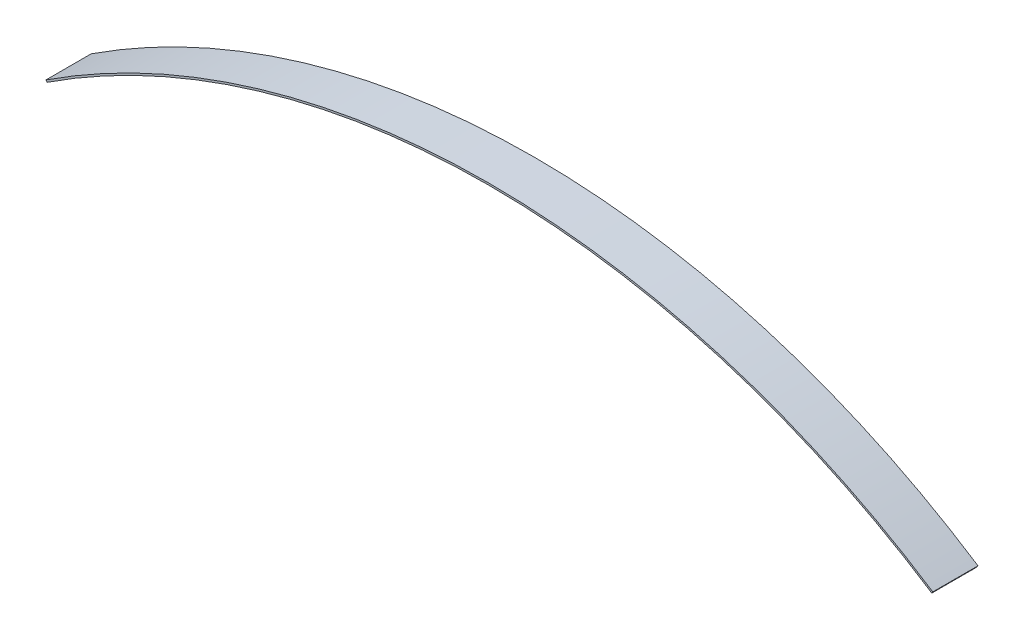
ISO-10303-21;
HEADER;
FILE_DESCRIPTION(('STEP AP214'),'2;1');
FILE_NAME('part.step','',(''),(''),'','','');
FILE_SCHEMA(('AUTOMOTIVE_DESIGN { 1 0 10303 214 1 1 1 1 }'));
ENDSEC;
DATA;
#1=APPLICATION_CONTEXT('core data for automotive mechanical design processes');
#2=APPLICATION_PROTOCOL_DEFINITION('international standard','automotive_design',2000,#1);
#3=PRODUCT_CONTEXT('',#1,'mechanical');
#4=PRODUCT('Part','Part','',(#3));
#5=PRODUCT_RELATED_PRODUCT_CATEGORY('part','',(#4));
#6=PRODUCT_DEFINITION_FORMATION('','',#4);
#7=PRODUCT_DEFINITION_CONTEXT('part definition',#1,'design');
#8=PRODUCT_DEFINITION('design','',#6,#7);
#9=PRODUCT_DEFINITION_SHAPE('','',#8);
#10=(LENGTH_UNIT() NAMED_UNIT(*) SI_UNIT(.MILLI.,.METRE.));
#11=(NAMED_UNIT(*) PLANE_ANGLE_UNIT() SI_UNIT($,.RADIAN.));
#12=(NAMED_UNIT(*) SI_UNIT($,.STERADIAN.) SOLID_ANGLE_UNIT());
#13=UNCERTAINTY_MEASURE_WITH_UNIT(LENGTH_MEASURE(1.E-05),#10,'distance_accuracy_value','');
#14=(GEOMETRIC_REPRESENTATION_CONTEXT(3) GLOBAL_UNCERTAINTY_ASSIGNED_CONTEXT((#13)) GLOBAL_UNIT_ASSIGNED_CONTEXT((#10,
#11,#12)) REPRESENTATION_CONTEXT('',''));
#15=CARTESIAN_POINT('',(0.,0.,0.));
#16=DIRECTION('',(0.,0.,1.));
#17=DIRECTION('',(1.,0.,0.));
#18=AXIS2_PLACEMENT_3D('',#15,#16,#17);
#19=CARTESIAN_POINT('',(18.1901731719178,-214.732142857143,12.));
#20=DIRECTION('',(0.,0.,-1.));
#21=DIRECTION('',(-1.,0.,0.));
#22=AXIS2_PLACEMENT_3D('',#19,#20,#21);
#23=CYLINDRICAL_SURFACE('',#22,214.732142857143);
#24=CARTESIAN_POINT('',(18.1901731719178,-214.732142857143,0.));
#25=DIRECTION('',(0.,0.,-1.));
#26=DIRECTION('',(-1.,0.,0.));
#27=AXIS2_PLACEMENT_3D('',#24,#25,#26);
#28=CIRCLE('',#27,214.732142857143);
#29=CARTESIAN_POINT('',(-99.3098268280822,-35.,0.));
#30=VERTEX_POINT('',#29);
#31=CARTESIAN_POINT('',(135.690173171918,-35.,0.));
#32=VERTEX_POINT('',#31);
#33=EDGE_CURVE('E93',#30,#32,#28,.T.);
#34=ORIENTED_EDGE('',*,*,#33,.T.);
#35=DIRECTION('',(0.,0.,-1.));
#36=VECTOR('',#35,1.);
#37=CARTESIAN_POINT('',(135.690173171918,-35.,12.));
#38=LINE('',#37,#36);
#39=CARTESIAN_POINT('',(135.690173171918,-35.,12.));
#40=VERTEX_POINT('',#39);
#41=EDGE_CURVE('E11',#40,#32,#38,.T.);
#42=ORIENTED_EDGE('',*,*,#41,.F.);
#43=CARTESIAN_POINT('',(18.1901731719178,-214.732142857143,12.));
#44=DIRECTION('',(0.,0.,-1.));
#45=DIRECTION('',(-1.,0.,0.));
#46=AXIS2_PLACEMENT_3D('',#43,#44,#45);
#47=CIRCLE('',#46,214.732142857143);
#48=CARTESIAN_POINT('',(-99.3098268280822,-35.,12.));
#49=VERTEX_POINT('',#48);
#50=EDGE_CURVE('E70',#49,#40,#47,.T.);
#51=ORIENTED_EDGE('',*,*,#50,.F.);
#52=DIRECTION('',(0.,0.,-1.));
#53=VECTOR('',#52,1.);
#54=CARTESIAN_POINT('',(-99.3098268280822,-35.,12.));
#55=LINE('',#54,#53);
#56=EDGE_CURVE('E46',#49,#30,#55,.T.);
#57=ORIENTED_EDGE('',*,*,#56,.T.);
#58=EDGE_LOOP('',(#34,#42,#51,#57));
#59=FACE_BOUND('',#58,.T.);
#60=ADVANCED_FACE('F30',(#59),#23,.F.);
#61=CARTESIAN_POINT('',(135.963769845514,-34.5814968814969,12.));
#62=DIRECTION('',(0.837006237006214,-0.547193347193382,0.));
#63=DIRECTION('',(0.547193347193382,0.837006237006214,0.));
#64=AXIS2_PLACEMENT_3D('',#61,#62,#63);
#65=PLANE('',#64);
#66=DIRECTION('',(-0.547193347193382,-0.837006237006214,0.));
#67=VECTOR('',#66,1.);
#68=CARTESIAN_POINT('',(135.963769845514,-34.5814968814969,0.));
#69=LINE('',#68,#67);
#70=CARTESIAN_POINT('',(135.963769845514,-34.5814968814969,0.));
#71=VERTEX_POINT('',#70);
#72=EDGE_CURVE('E79',#71,#32,#69,.T.);
#73=ORIENTED_EDGE('',*,*,#72,.F.);
#74=DIRECTION('',(0.,0.,-1.));
#75=VECTOR('',#74,1.);
#76=CARTESIAN_POINT('',(135.963769845514,-34.5814968814969,12.));
#77=LINE('',#76,#75);
#78=CARTESIAN_POINT('',(135.963769845514,-34.5814968814969,12.));
#79=VERTEX_POINT('',#78);
#80=EDGE_CURVE('E38',#79,#71,#77,.T.);
#81=ORIENTED_EDGE('',*,*,#80,.F.);
#82=DIRECTION('',(-0.547193347193382,-0.837006237006214,0.));
#83=VECTOR('',#82,1.);
#84=CARTESIAN_POINT('',(135.963769845514,-34.5814968814969,12.));
#85=LINE('',#84,#83);
#86=EDGE_CURVE('E77',#79,#40,#85,.T.);
#87=ORIENTED_EDGE('',*,*,#86,.T.);
#88=ORIENTED_EDGE('',*,*,#41,.T.);
#89=EDGE_LOOP('',(#73,#81,#87,#88));
#90=FACE_BOUND('',#89,.T.);
#91=ADVANCED_FACE('F76',(#90),#65,.T.);
#92=CARTESIAN_POINT('',(18.1901731719178,-214.732142857143,12.));
#93=DIRECTION('',(0.,0.,-1.));
#94=DIRECTION('',(-1.,0.,0.));
#95=AXIS2_PLACEMENT_3D('',#92,#93,#94);
#96=CYLINDRICAL_SURFACE('',#95,215.232142857143);
#97=CARTESIAN_POINT('',(18.1901731719178,-214.732142857143,0.));
#98=DIRECTION('',(0.,0.,1.));
#99=DIRECTION('',(1.,0.,0.));
#100=AXIS2_PLACEMENT_3D('',#97,#98,#99);
#101=CIRCLE('',#100,215.232142857143);
#102=CARTESIAN_POINT('',(-99.5834235016789,-34.5814968814969,0.));
#103=VERTEX_POINT('',#102);
#104=EDGE_CURVE('E96',#103,#71,#101,.F.);
#105=ORIENTED_EDGE('',*,*,#104,.F.);
#106=DIRECTION('',(0.,0.,-1.));
#107=VECTOR('',#106,1.);
#108=CARTESIAN_POINT('',(-99.5834235016789,-34.5814968814969,12.));
#109=LINE('',#108,#107);
#110=CARTESIAN_POINT('',(-99.5834235016789,-34.5814968814969,12.));
#111=VERTEX_POINT('',#110);
#112=EDGE_CURVE('E59',#111,#103,#109,.T.);
#113=ORIENTED_EDGE('',*,*,#112,.F.);
#114=CARTESIAN_POINT('',(18.1901731719178,-214.732142857143,12.));
#115=DIRECTION('',(0.,0.,1.));
#116=DIRECTION('',(1.,0.,0.));
#117=AXIS2_PLACEMENT_3D('',#114,#115,#116);
#118=CIRCLE('',#117,215.232142857143);
#119=EDGE_CURVE('E85',#111,#79,#118,.F.);
#120=ORIENTED_EDGE('',*,*,#119,.T.);
#121=ORIENTED_EDGE('',*,*,#80,.T.);
#122=EDGE_LOOP('',(#105,#113,#120,#121));
#123=FACE_BOUND('',#122,.T.);
#124=ADVANCED_FACE('F87',(#123),#96,.T.);
#125=CARTESIAN_POINT('',(-99.3098268280822,-35.,12.));
#126=DIRECTION('',(-0.837006237006214,-0.547193347193382,0.));
#127=DIRECTION('',(0.547193347193382,-0.837006237006214,0.));
#128=AXIS2_PLACEMENT_3D('',#125,#126,#127);
#129=PLANE('',#128);
#130=DIRECTION('',(-0.547193347193382,0.837006237006214,0.));
#131=VECTOR('',#130,1.);
#132=CARTESIAN_POINT('',(-99.3098268280822,-35.,0.));
#133=LINE('',#132,#131);
#134=EDGE_CURVE('E98',#30,#103,#133,.T.);
#135=ORIENTED_EDGE('',*,*,#134,.F.);
#136=ORIENTED_EDGE('',*,*,#56,.F.);
#137=DIRECTION('',(-0.547193347193382,0.837006237006214,0.));
#138=VECTOR('',#137,1.);
#139=CARTESIAN_POINT('',(-99.3098268280822,-35.,12.));
#140=LINE('',#139,#138);
#141=EDGE_CURVE('E88',#49,#111,#140,.T.);
#142=ORIENTED_EDGE('',*,*,#141,.T.);
#143=ORIENTED_EDGE('',*,*,#112,.T.);
#144=EDGE_LOOP('',(#135,#136,#142,#143));
#145=FACE_BOUND('',#144,.T.);
#146=ADVANCED_FACE('F104',(#145),#129,.T.);
#147=CARTESIAN_POINT('',(18.1901731719178,-214.732142857143,12.));
#148=DIRECTION('',(0.,0.,-1.));
#149=DIRECTION('',(-1.,0.,0.));
#150=AXIS2_PLACEMENT_3D('',#147,#148,#149);
#151=PLANE('',#150);
#152=ORIENTED_EDGE('',*,*,#50,.T.);
#153=ORIENTED_EDGE('',*,*,#86,.F.);
#154=ORIENTED_EDGE('',*,*,#119,.F.);
#155=ORIENTED_EDGE('',*,*,#141,.F.);
#156=EDGE_LOOP('',(#152,#153,#154,#155));
#157=FACE_BOUND('',#156,.T.);
#158=ADVANCED_FACE('F84',(#157),#151,.F.);
#159=CARTESIAN_POINT('',(18.1901731719178,-214.732142857143,0.));
#160=DIRECTION('',(0.,0.,-1.));
#161=DIRECTION('',(-1.,0.,0.));
#162=AXIS2_PLACEMENT_3D('',#159,#160,#161);
#163=PLANE('',#162);
#164=ORIENTED_EDGE('',*,*,#33,.F.);
#165=ORIENTED_EDGE('',*,*,#134,.T.);
#166=ORIENTED_EDGE('',*,*,#104,.T.);
#167=ORIENTED_EDGE('',*,*,#72,.T.);
#168=EDGE_LOOP('',(#164,#165,#166,#167));
#169=FACE_BOUND('',#168,.T.);
#170=ADVANCED_FACE('F103',(#169),#163,.T.);
#171=CLOSED_SHELL('',(#60,#91,#124,#146,#158,#170));
#172=MANIFOLD_SOLID_BREP('B2',#171);
#173=ADVANCED_BREP_SHAPE_REPRESENTATION('',(#18,#172),#14);
#174=SHAPE_DEFINITION_REPRESENTATION(#9,#173);
ENDSEC;
END-ISO-10303-21;
